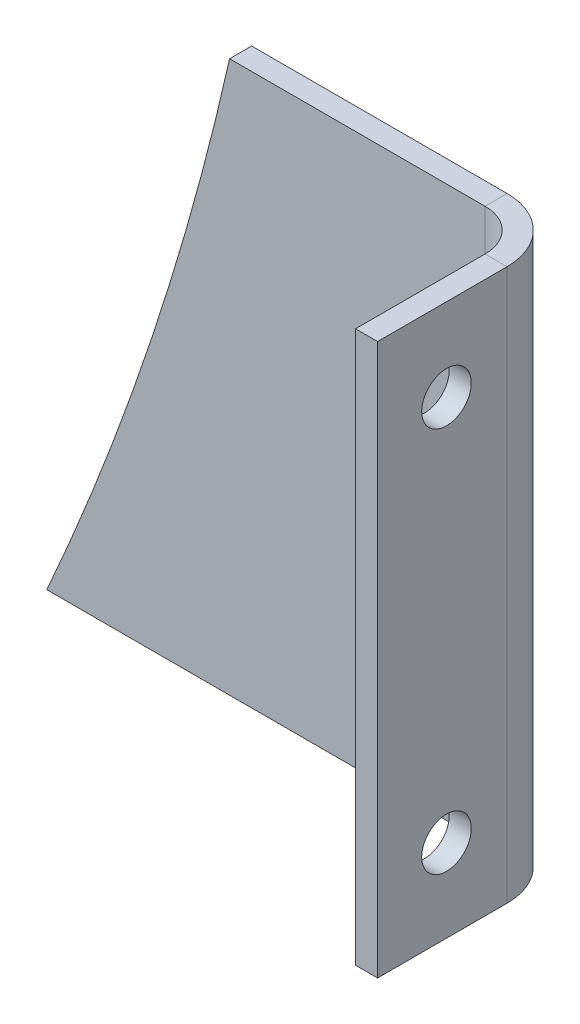
ISO-10303-21;
HEADER;
FILE_DESCRIPTION(('STEP AP214'),'2;1');
FILE_NAME('part.step','',(''),(''),'','','');
FILE_SCHEMA(('AUTOMOTIVE_DESIGN { 1 0 10303 214 1 1 1 1 }'));
ENDSEC;
DATA;
#1=APPLICATION_CONTEXT('core data for automotive mechanical design processes');
#2=APPLICATION_PROTOCOL_DEFINITION('international standard','automotive_design',2000,#1);
#3=PRODUCT_CONTEXT('',#1,'mechanical');
#4=PRODUCT('Part','Part','',(#3));
#5=PRODUCT_RELATED_PRODUCT_CATEGORY('part','',(#4));
#6=PRODUCT_DEFINITION_FORMATION('','',#4);
#7=PRODUCT_DEFINITION_CONTEXT('part definition',#1,'design');
#8=PRODUCT_DEFINITION('design','',#6,#7);
#9=PRODUCT_DEFINITION_SHAPE('','',#8);
#10=(LENGTH_UNIT() NAMED_UNIT(*) SI_UNIT(.MILLI.,.METRE.));
#11=(NAMED_UNIT(*) PLANE_ANGLE_UNIT() SI_UNIT($,.RADIAN.));
#12=(NAMED_UNIT(*) SI_UNIT($,.STERADIAN.) SOLID_ANGLE_UNIT());
#13=UNCERTAINTY_MEASURE_WITH_UNIT(LENGTH_MEASURE(1.E-05),#10,'distance_accuracy_value','');
#14=(GEOMETRIC_REPRESENTATION_CONTEXT(3) GLOBAL_UNCERTAINTY_ASSIGNED_CONTEXT((#13)) GLOBAL_UNIT_ASSIGNED_CONTEXT((#10,
#11,#12)) REPRESENTATION_CONTEXT('',''));
#15=CARTESIAN_POINT('',(0.,0.,0.));
#16=DIRECTION('',(0.,0.,1.));
#17=DIRECTION('',(1.,0.,0.));
#18=AXIS2_PLACEMENT_3D('',#15,#16,#17);
#19=CARTESIAN_POINT('',(-8.00000000000001,100.000000000001,-35.));
#20=DIRECTION('',(0.,1.00000000000001,0.));
#21=DIRECTION('',(-1.00000000000001,0.,0.));
#22=AXIS2_PLACEMENT_3D('',#19,#20,#21);
#23=PLANE('',#22);
#24=DIRECTION('',(-1.00000000000001,0.,0.));
#25=VECTOR('',#24,1.);
#26=CARTESIAN_POINT('',(0.,100.000000000001,-27.));
#27=LINE('',#26,#25);
#28=CARTESIAN_POINT('',(-115.700236875208,100.000000000001,-27.0000000000004));
#29=VERTEX_POINT('',#28);
#30=CARTESIAN_POINT('',(-22.9999999999999,100.000000000001,-27.0000000000001));
#31=VERTEX_POINT('',#30);
#32=EDGE_CURVE('E108',#29,#31,#27,.F.);
#33=ORIENTED_EDGE('',*,*,#32,.T.);
#34=DIRECTION('',(0.,0.,-1.));
#35=VECTOR('',#34,1.);
#36=CARTESIAN_POINT('',(-22.9999999999999,100.000000000001,-27.0000000000001));
#37=LINE('',#36,#35);
#38=CARTESIAN_POINT('',(-22.9999999999999,100.000000000001,-35.0000000000001));
#39=VERTEX_POINT('',#38);
#40=EDGE_CURVE('E125',#31,#39,#37,.T.);
#41=ORIENTED_EDGE('',*,*,#40,.T.);
#42=DIRECTION('',(1.00000000000001,0.,0.));
#43=VECTOR('',#42,1.);
#44=CARTESIAN_POINT('',(-8.00000000000001,100.000000000001,-35.));
#45=LINE('',#44,#43);
#46=CARTESIAN_POINT('',(-115.700236875208,100.000000000001,-35.));
#47=VERTEX_POINT('',#46);
#48=EDGE_CURVE('E149',#47,#39,#45,.T.);
#49=ORIENTED_EDGE('',*,*,#48,.F.);
#50=DIRECTION('',(0.,0.,-1.));
#51=VECTOR('',#50,1.);
#52=CARTESIAN_POINT('',(-115.700236875208,100.000000000001,-35.));
#53=LINE('',#52,#51);
#54=EDGE_CURVE('E117',#47,#29,#53,.F.);
#55=ORIENTED_EDGE('',*,*,#54,.T.);
#56=EDGE_LOOP('',(#33,#41,#49,#55));
#57=FACE_BOUND('',#56,.T.);
#58=ADVANCED_FACE('F35',(#57),#23,.T.);
#59=CARTESIAN_POINT('',(-250.000000000001,-100.000000000001,-35.0000000000009));
#60=DIRECTION('',(0.,-1.00000000000001,0.));
#61=DIRECTION('',(1.00000000000001,0.,0.));
#62=AXIS2_PLACEMENT_3D('',#59,#60,#61);
#63=PLANE('',#62);
#64=DIRECTION('',(-1.00000000000001,0.,0.));
#65=VECTOR('',#64,1.);
#66=CARTESIAN_POINT('',(-250.000000000001,-100.000000000001,-35.0000000000009));
#67=LINE('',#66,#65);
#68=CARTESIAN_POINT('',(-22.9999999999975,-100.000000000001,-35.0000000000001));
#69=VERTEX_POINT('',#68);
#70=CARTESIAN_POINT('',(-182.024793705954,-100.000000000001,-35.));
#71=VERTEX_POINT('',#70);
#72=EDGE_CURVE('E123',#69,#71,#67,.T.);
#73=ORIENTED_EDGE('',*,*,#72,.F.);
#74=DIRECTION('',(0.,0.,-1.));
#75=VECTOR('',#74,1.);
#76=CARTESIAN_POINT('',(-22.9999999999975,-100.000000000001,-35.0000000000009));
#77=LINE('',#76,#75);
#78=CARTESIAN_POINT('',(-22.9999999999975,-100.000000000001,-27.0000000000001));
#79=VERTEX_POINT('',#78);
#80=EDGE_CURVE('E120',#79,#69,#77,.T.);
#81=ORIENTED_EDGE('',*,*,#80,.F.);
#82=DIRECTION('',(1.00000000000001,0.,0.));
#83=VECTOR('',#82,1.);
#84=CARTESIAN_POINT('',(2.66453525910038E-12,-100.000000000001,-27.));
#85=LINE('',#84,#83);
#86=CARTESIAN_POINT('',(-182.024793705954,-100.000000000001,-26.9999999999966));
#87=VERTEX_POINT('',#86);
#88=EDGE_CURVE('E105',#79,#87,#85,.F.);
#89=ORIENTED_EDGE('',*,*,#88,.T.);
#90=DIRECTION('',(0.,0.,-1.));
#91=VECTOR('',#90,1.);
#92=CARTESIAN_POINT('',(-182.024793705954,-100.000000000001,-35.));
#93=LINE('',#92,#91);
#94=EDGE_CURVE('E109',#71,#87,#93,.F.);
#95=ORIENTED_EDGE('',*,*,#94,.F.);
#96=EDGE_LOOP('',(#73,#81,#89,#95));
#97=FACE_BOUND('',#96,.T.);
#98=ADVANCED_FACE('F119',(#97),#63,.T.);
#99=CARTESIAN_POINT('',(-8.00000000000001,100.000000000001,35.));
#100=DIRECTION('',(0.,1.00000000000001,0.));
#101=DIRECTION('',(0.,0.,-1.));
#102=AXIS2_PLACEMENT_3D('',#99,#100,#101);
#103=PLANE('',#102);
#104=DIRECTION('',(0.,0.,-1.));
#105=VECTOR('',#104,1.);
#106=CARTESIAN_POINT('',(-8.00000000000001,100.000000000001,35.));
#107=LINE('',#106,#105);
#108=CARTESIAN_POINT('',(-8.00000000000001,100.000000000001,35.));
#109=VERTEX_POINT('',#108);
#110=CARTESIAN_POINT('',(-8.00000000000001,100.000000000001,-12.0000000000001));
#111=VERTEX_POINT('',#110);
#112=EDGE_CURVE('E161',#109,#111,#107,.T.);
#113=ORIENTED_EDGE('',*,*,#112,.F.);
#114=DIRECTION('',(1.00000000000001,0.,0.));
#115=VECTOR('',#114,1.);
#116=CARTESIAN_POINT('',(-8.00000000000001,100.000000000001,35.));
#117=LINE('',#116,#115);
#118=CARTESIAN_POINT('',(0.,100.000000000001,35.));
#119=VERTEX_POINT('',#118);
#120=EDGE_CURVE('E11',#109,#119,#117,.T.);
#121=ORIENTED_EDGE('',*,*,#120,.T.);
#122=DIRECTION('',(0.,0.,-1.));
#123=VECTOR('',#122,1.);
#124=CARTESIAN_POINT('',(0.,100.000000000001,35.));
#125=LINE('',#124,#123);
#126=CARTESIAN_POINT('',(0.,100.000000000001,-12.0000000000001));
#127=VERTEX_POINT('',#126);
#128=EDGE_CURVE('E159',#119,#127,#125,.T.);
#129=ORIENTED_EDGE('',*,*,#128,.T.);
#130=DIRECTION('',(1.00000000000001,0.,0.));
#131=VECTOR('',#130,1.);
#132=CARTESIAN_POINT('',(-8.00000000000001,100.000000000001,-12.0000000000001));
#133=LINE('',#132,#131);
#134=EDGE_CURVE('E139',#111,#127,#133,.T.);
#135=ORIENTED_EDGE('',*,*,#134,.F.);
#136=EDGE_LOOP('',(#113,#121,#129,#135));
#137=FACE_BOUND('',#136,.T.);
#138=ADVANCED_FACE('F173',(#137),#103,.T.);
#139=CARTESIAN_POINT('',(-8.00000000000001,0.,0.));
#140=DIRECTION('',(1.00000000000001,0.,0.));
#141=DIRECTION('',(0.,0.,1.));
#142=AXIS2_PLACEMENT_3D('',#139,#140,#141);
#143=PLANE('',#142);
#144=CARTESIAN_POINT('',(-8.00000000000001,70.,9.99999999999999));
#145=DIRECTION('',(-1.00000000000001,0.,0.));
#146=DIRECTION('',(0.,0.,1.));
#147=AXIS2_PLACEMENT_3D('',#144,#145,#146);
#148=CIRCLE('',#147,9.00000000000002);
#149=CARTESIAN_POINT('',(-8.00000000000001,70.,19.));
#150=VERTEX_POINT('',#149);
#151=EDGE_CURVE('E209',#150,#150,#148,.T.);
#152=ORIENTED_EDGE('',*,*,#151,.F.);
#153=EDGE_LOOP('',(#152));
#154=FACE_BOUND('',#153,.T.);
#155=CARTESIAN_POINT('',(-8.00000000000001,-70.0000000000012,10.0000000000003));
#156=DIRECTION('',(-1.00000000000001,0.,0.));
#157=DIRECTION('',(0.,0.,1.));
#158=AXIS2_PLACEMENT_3D('',#155,#156,#157);
#159=CIRCLE('',#158,9.00000000000002);
#160=CARTESIAN_POINT('',(-8.00000000000001,-70.0000000000012,19.0000000000003));
#161=VERTEX_POINT('',#160);
#162=EDGE_CURVE('E202',#161,#161,#159,.T.);
#163=ORIENTED_EDGE('',*,*,#162,.F.);
#164=EDGE_LOOP('',(#163));
#165=FACE_BOUND('',#164,.T.);
#166=DIRECTION('',(0.,1.00000000000001,0.));
#167=VECTOR('',#166,1.);
#168=CARTESIAN_POINT('',(-8.00000000000001,100.000000000001,-12.0000000000001));
#169=LINE('',#168,#167);
#170=CARTESIAN_POINT('',(-7.99999999999756,-100.000000000002,-12.0000000000001));
#171=VERTEX_POINT('',#170);
#172=EDGE_CURVE('E144',#111,#171,#169,.F.);
#173=ORIENTED_EDGE('',*,*,#172,.T.);
#174=DIRECTION('',(0.,0.,1.));
#175=VECTOR('',#174,1.);
#176=CARTESIAN_POINT('',(-7.99999999999756,-100.000000000002,35.0000000000003));
#177=LINE('',#176,#175);
#178=CARTESIAN_POINT('',(-7.99999999999756,-100.000000000002,35.0000000000003));
#179=VERTEX_POINT('',#178);
#180=EDGE_CURVE('E155',#171,#179,#177,.T.);
#181=ORIENTED_EDGE('',*,*,#180,.T.);
#182=DIRECTION('',(0.,1.00000000000001,0.));
#183=VECTOR('',#182,1.);
#184=CARTESIAN_POINT('',(-7.99999999999756,-100.000000000002,35.0000000000003));
#185=LINE('',#184,#183);
#186=EDGE_CURVE('E158',#179,#109,#185,.T.);
#187=ORIENTED_EDGE('',*,*,#186,.T.);
#188=ORIENTED_EDGE('',*,*,#112,.T.);
#189=EDGE_LOOP('',(#173,#181,#187,#188));
#190=FACE_BOUND('',#189,.T.);
#191=ADVANCED_FACE('F191',(#154,#165,#190),#143,.F.);
#192=CARTESIAN_POINT('',(0.,0.,0.));
#193=DIRECTION('',(1.00000000000001,0.,0.));
#194=DIRECTION('',(0.,0.,1.));
#195=AXIS2_PLACEMENT_3D('',#192,#193,#194);
#196=PLANE('',#195);
#197=CARTESIAN_POINT('',(0.,70.,9.99999999999999));
#198=DIRECTION('',(-1.00000000000001,0.,0.));
#199=DIRECTION('',(0.,0.,1.));
#200=AXIS2_PLACEMENT_3D('',#197,#198,#199);
#201=CIRCLE('',#200,9.00000000000002);
#202=CARTESIAN_POINT('',(0.,70.,19.));
#203=VERTEX_POINT('',#202);
#204=EDGE_CURVE('E212',#203,#203,#201,.T.);
#205=ORIENTED_EDGE('',*,*,#204,.T.);
#206=EDGE_LOOP('',(#205));
#207=FACE_BOUND('',#206,.T.);
#208=CARTESIAN_POINT('',(0.,-70.0000000000012,10.0000000000003));
#209=DIRECTION('',(-1.00000000000001,0.,0.));
#210=DIRECTION('',(0.,0.,1.));
#211=AXIS2_PLACEMENT_3D('',#208,#209,#210);
#212=CIRCLE('',#211,9.00000000000002);
#213=CARTESIAN_POINT('',(0.,-70.0000000000012,19.0000000000003));
#214=VERTEX_POINT('',#213);
#215=EDGE_CURVE('E206',#214,#214,#212,.T.);
#216=ORIENTED_EDGE('',*,*,#215,.T.);
#217=EDGE_LOOP('',(#216));
#218=FACE_BOUND('',#217,.T.);
#219=ORIENTED_EDGE('',*,*,#128,.F.);
#220=DIRECTION('',(0.,1.00000000000001,0.));
#221=VECTOR('',#220,1.);
#222=CARTESIAN_POINT('',(2.44249065417534E-12,-100.000000000001,35.0000000000003));
#223=LINE('',#222,#221);
#224=CARTESIAN_POINT('',(2.44249065417534E-12,-100.000000000001,35.0000000000003));
#225=VERTEX_POINT('',#224);
#226=EDGE_CURVE('E166',#225,#119,#223,.T.);
#227=ORIENTED_EDGE('',*,*,#226,.F.);
#228=DIRECTION('',(0.,0.,1.));
#229=VECTOR('',#228,1.);
#230=CARTESIAN_POINT('',(2.44249065417534E-12,-100.000000000001,35.0000000000003));
#231=LINE('',#230,#229);
#232=CARTESIAN_POINT('',(2.44249065417534E-12,-100.000000000001,-12.0000000000001));
#233=VERTEX_POINT('',#232);
#234=EDGE_CURVE('E152',#233,#225,#231,.T.);
#235=ORIENTED_EDGE('',*,*,#234,.F.);
#236=DIRECTION('',(0.,1.00000000000001,0.));
#237=VECTOR('',#236,1.);
#238=CARTESIAN_POINT('',(0.,100.000000000001,-12.0000000000001));
#239=LINE('',#238,#237);
#240=EDGE_CURVE('E134',#127,#233,#239,.F.);
#241=ORIENTED_EDGE('',*,*,#240,.F.);
#242=EDGE_LOOP('',(#219,#227,#235,#241));
#243=FACE_BOUND('',#242,.T.);
#244=ADVANCED_FACE('F178',(#207,#218,#243),#196,.T.);
#245=CARTESIAN_POINT('',(-7.99999999999756,-100.000000000002,35.0000000000003));
#246=DIRECTION('',(0.,0.,1.));
#247=DIRECTION('',(-1.00000000000001,0.,0.));
#248=AXIS2_PLACEMENT_3D('',#245,#246,#247);
#249=PLANE('',#248);
#250=ORIENTED_EDGE('',*,*,#226,.T.);
#251=ORIENTED_EDGE('',*,*,#120,.F.);
#252=ORIENTED_EDGE('',*,*,#186,.F.);
#253=DIRECTION('',(1.00000000000001,0.,0.));
#254=VECTOR('',#253,1.);
#255=CARTESIAN_POINT('',(-7.99999999999756,-100.000000000002,35.0000000000003));
#256=LINE('',#255,#254);
#257=EDGE_CURVE('E39',#179,#225,#256,.T.);
#258=ORIENTED_EDGE('',*,*,#257,.T.);
#259=EDGE_LOOP('',(#250,#251,#252,#258));
#260=FACE_BOUND('',#259,.T.);
#261=ADVANCED_FACE('F195',(#260),#249,.T.);
#262=CARTESIAN_POINT('',(-7.99999999999756,-100.000000000002,35.0000000000003));
#263=DIRECTION('',(0.,-1.00000000000001,0.));
#264=DIRECTION('',(0.,0.,1.));
#265=AXIS2_PLACEMENT_3D('',#262,#263,#264);
#266=PLANE('',#265);
#267=DIRECTION('',(1.00000000000001,0.,0.));
#268=VECTOR('',#267,1.);
#269=CARTESIAN_POINT('',(-7.99999999999756,-100.000000000002,-12.0000000000001));
#270=LINE('',#269,#268);
#271=EDGE_CURVE('E150',#171,#233,#270,.T.);
#272=ORIENTED_EDGE('',*,*,#271,.T.);
#273=ORIENTED_EDGE('',*,*,#234,.T.);
#274=ORIENTED_EDGE('',*,*,#257,.F.);
#275=ORIENTED_EDGE('',*,*,#180,.F.);
#276=EDGE_LOOP('',(#272,#273,#274,#275));
#277=FACE_BOUND('',#276,.T.);
#278=ADVANCED_FACE('F37',(#277),#266,.T.);
#279=CARTESIAN_POINT('',(-22.9999999999975,-100.000000000001,-12.0000000000001));
#280=DIRECTION('',(0.,-1.00000000000001,0.));
#281=DIRECTION('',(0.,0.,1.));
#282=AXIS2_PLACEMENT_3D('',#279,#280,#281);
#283=PLANE('',#282);
#284=ORIENTED_EDGE('',*,*,#80,.T.);
#285=CARTESIAN_POINT('',(-22.9999999999975,-100.000000000001,-12.0000000000001));
#286=DIRECTION('',(0.,-1.00000000000001,0.));
#287=DIRECTION('',(0.,0.,-1.));
#288=AXIS2_PLACEMENT_3D('',#285,#286,#287);
#289=CIRCLE('',#288,23.);
#290=EDGE_CURVE('E58',#233,#69,#289,.F.);
#291=ORIENTED_EDGE('',*,*,#290,.F.);
#292=ORIENTED_EDGE('',*,*,#271,.F.);
#293=CARTESIAN_POINT('',(-22.9999999999975,-100.000000000001,-12.0000000000001));
#294=DIRECTION('',(0.,-1.00000000000001,0.));
#295=DIRECTION('',(0.,0.,-1.));
#296=AXIS2_PLACEMENT_3D('',#293,#294,#295);
#297=CIRCLE('',#296,15.);
#298=EDGE_CURVE('E141',#171,#79,#297,.F.);
#299=ORIENTED_EDGE('',*,*,#298,.T.);
#300=EDGE_LOOP('',(#284,#291,#292,#299));
#301=FACE_BOUND('',#300,.T.);
#302=ADVANCED_FACE('F197',(#301),#283,.T.);
#303=CARTESIAN_POINT('',(-22.9999999999999,100.000000000001,-12.0000000000001));
#304=DIRECTION('',(0.,-1.00000000000001,0.));
#305=DIRECTION('',(0.,0.,1.));
#306=AXIS2_PLACEMENT_3D('',#303,#304,#305);
#307=PLANE('',#306);
#308=CARTESIAN_POINT('',(-22.9999999999999,100.000000000001,-12.0000000000001));
#309=DIRECTION('',(0.,-1.00000000000001,0.));
#310=DIRECTION('',(0.,0.,-1.));
#311=AXIS2_PLACEMENT_3D('',#308,#309,#310);
#312=CIRCLE('',#311,15.);
#313=EDGE_CURVE('E147',#31,#111,#312,.T.);
#314=ORIENTED_EDGE('',*,*,#313,.T.);
#315=ORIENTED_EDGE('',*,*,#134,.T.);
#316=CARTESIAN_POINT('',(-22.9999999999999,100.000000000001,-12.0000000000001));
#317=DIRECTION('',(0.,-1.00000000000001,0.));
#318=DIRECTION('',(0.,0.,-1.));
#319=AXIS2_PLACEMENT_3D('',#316,#317,#318);
#320=CIRCLE('',#319,23.);
#321=EDGE_CURVE('E137',#39,#127,#320,.T.);
#322=ORIENTED_EDGE('',*,*,#321,.F.);
#323=ORIENTED_EDGE('',*,*,#40,.F.);
#324=EDGE_LOOP('',(#314,#315,#322,#323));
#325=FACE_BOUND('',#324,.T.);
#326=ADVANCED_FACE('F183',(#325),#307,.F.);
#327=CARTESIAN_POINT('',(-22.9999999999999,100.000000000001,-12.0000000000001));
#328=DIRECTION('',(0.,1.00000000000001,0.));
#329=DIRECTION('',(0.,0.,-1.));
#330=AXIS2_PLACEMENT_3D('',#327,#328,#329);
#331=CYLINDRICAL_SURFACE('',#330,23.);
#332=ORIENTED_EDGE('',*,*,#240,.T.);
#333=ORIENTED_EDGE('',*,*,#290,.T.);
#334=DIRECTION('',(0.,1.00000000000001,0.));
#335=VECTOR('',#334,1.);
#336=CARTESIAN_POINT('',(-22.9999999999999,0.,-35.0000000000001));
#337=LINE('',#336,#335);
#338=EDGE_CURVE('E121',#69,#39,#337,.T.);
#339=ORIENTED_EDGE('',*,*,#338,.T.);
#340=ORIENTED_EDGE('',*,*,#321,.T.);
#341=EDGE_LOOP('',(#332,#333,#339,#340));
#342=FACE_BOUND('',#341,.T.);
#343=ADVANCED_FACE('F248',(#342),#331,.T.);
#344=CARTESIAN_POINT('',(-22.9999999999999,100.000000000001,-12.0000000000001));
#345=DIRECTION('',(0.,1.00000000000001,0.));
#346=DIRECTION('',(0.,0.,-1.));
#347=AXIS2_PLACEMENT_3D('',#344,#345,#346);
#348=CYLINDRICAL_SURFACE('',#347,15.);
#349=ORIENTED_EDGE('',*,*,#172,.F.);
#350=ORIENTED_EDGE('',*,*,#313,.F.);
#351=DIRECTION('',(0.,-1.00000000000001,0.));
#352=VECTOR('',#351,1.);
#353=CARTESIAN_POINT('',(-22.9999999999975,-100.000000000001,-27.0000000000001));
#354=LINE('',#353,#352);
#355=EDGE_CURVE('E131',#79,#31,#354,.F.);
#356=ORIENTED_EDGE('',*,*,#355,.F.);
#357=ORIENTED_EDGE('',*,*,#298,.F.);
#358=EDGE_LOOP('',(#349,#350,#356,#357));
#359=FACE_BOUND('',#358,.T.);
#360=ADVANCED_FACE('F189',(#359),#348,.F.);
#361=CARTESIAN_POINT('',(2.22044604925031E-13,0.,-35.));
#362=DIRECTION('',(0.,0.,-1.));
#363=DIRECTION('',(1.00000000000001,0.,0.));
#364=AXIS2_PLACEMENT_3D('',#361,#362,#363);
#365=PLANE('',#364);
#366=ORIENTED_EDGE('',*,*,#48,.T.);
#367=ORIENTED_EDGE('',*,*,#338,.F.);
#368=ORIENTED_EDGE('',*,*,#72,.T.);
#369=CARTESIAN_POINT('',(-1150.00000000001,332.000000000004,-35.));
#370=DIRECTION('',(0.,0.,1.));
#371=DIRECTION('',(1.00000000000001,0.,0.));
#372=AXIS2_PLACEMENT_3D('',#369,#370,#371);
#373=CIRCLE('',#372,1060.);
#374=EDGE_CURVE('E110',#71,#47,#373,.T.);
#375=ORIENTED_EDGE('',*,*,#374,.T.);
#376=EDGE_LOOP('',(#366,#367,#368,#375));
#377=FACE_BOUND('',#376,.T.);
#378=ADVANCED_FACE('F253',(#377),#365,.T.);
#379=CARTESIAN_POINT('',(2.22044604925031E-13,0.,-27.));
#380=DIRECTION('',(0.,0.,-1.));
#381=DIRECTION('',(1.00000000000001,0.,0.));
#382=AXIS2_PLACEMENT_3D('',#379,#380,#381);
#383=PLANE('',#382);
#384=CARTESIAN_POINT('',(-1150.00000000001,332.000000000004,-27.));
#385=DIRECTION('',(0.,0.,1.));
#386=DIRECTION('',(1.00000000000001,0.,0.));
#387=AXIS2_PLACEMENT_3D('',#384,#385,#386);
#388=CIRCLE('',#387,1060.);
#389=EDGE_CURVE('E50',#87,#29,#388,.T.);
#390=ORIENTED_EDGE('',*,*,#389,.F.);
#391=ORIENTED_EDGE('',*,*,#88,.F.);
#392=ORIENTED_EDGE('',*,*,#355,.T.);
#393=ORIENTED_EDGE('',*,*,#32,.F.);
#394=EDGE_LOOP('',(#390,#391,#392,#393));
#395=FACE_BOUND('',#394,.T.);
#396=ADVANCED_FACE('F103',(#395),#383,.F.);
#397=CARTESIAN_POINT('',(-1150.00000000001,332.000000000004,-35.));
#398=DIRECTION('',(0.,0.,-1.));
#399=DIRECTION('',(1.00000000000001,0.,0.));
#400=AXIS2_PLACEMENT_3D('',#397,#398,#399);
#401=CYLINDRICAL_SURFACE('',#400,1060.);
#402=ORIENTED_EDGE('',*,*,#374,.F.);
#403=ORIENTED_EDGE('',*,*,#94,.T.);
#404=ORIENTED_EDGE('',*,*,#389,.T.);
#405=ORIENTED_EDGE('',*,*,#54,.F.);
#406=EDGE_LOOP('',(#402,#403,#404,#405));
#407=FACE_BOUND('',#406,.T.);
#408=ADVANCED_FACE('F113',(#407),#401,.F.);
#409=CARTESIAN_POINT('',(-10.,-70.0000000000014,10.0000000000003));
#410=DIRECTION('',(1.00000000000001,0.,0.));
#411=DIRECTION('',(0.,0.,1.));
#412=AXIS2_PLACEMENT_3D('',#409,#410,#411);
#413=CYLINDRICAL_SURFACE('',#412,9.00000000000002);
#414=ORIENTED_EDGE('',*,*,#215,.F.);
#415=EDGE_LOOP('',(#414));
#416=FACE_BOUND('',#415,.T.);
#417=ORIENTED_EDGE('',*,*,#162,.T.);
#418=EDGE_LOOP('',(#417));
#419=FACE_BOUND('',#418,.T.);
#420=ADVANCED_FACE('F221',(#416,#419),#413,.F.);
#421=CARTESIAN_POINT('',(-10.,70.,9.99999999999999));
#422=DIRECTION('',(1.00000000000001,0.,0.));
#423=DIRECTION('',(0.,0.,1.));
#424=AXIS2_PLACEMENT_3D('',#421,#422,#423);
#425=CYLINDRICAL_SURFACE('',#424,9.00000000000002);
#426=ORIENTED_EDGE('',*,*,#204,.F.);
#427=EDGE_LOOP('',(#426));
#428=FACE_BOUND('',#427,.T.);
#429=ORIENTED_EDGE('',*,*,#151,.T.);
#430=EDGE_LOOP('',(#429));
#431=FACE_BOUND('',#430,.T.);
#432=ADVANCED_FACE('F218',(#428,#431),#425,.F.);
#433=CLOSED_SHELL('',(#58,#98,#138,#191,#244,#261,#278,#302,#326,#343,#360,#378,#396,#408,#420,#432));
#434=MANIFOLD_SOLID_BREP('B2',#433);
#435=ADVANCED_BREP_SHAPE_REPRESENTATION('',(#18,#434),#14);
#436=SHAPE_DEFINITION_REPRESENTATION(#9,#435);
ENDSEC;
END-ISO-10303-21;
